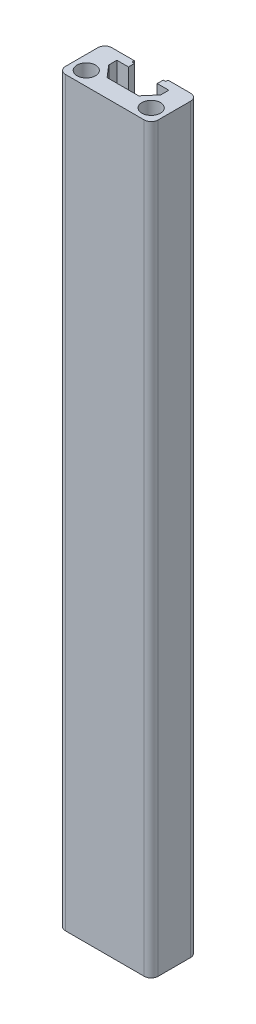
ISO-10303-21;
HEADER;
FILE_DESCRIPTION(('STEP AP214'),'2;1');
FILE_NAME('part.step','',(''),(''),'','','');
FILE_SCHEMA(('AUTOMOTIVE_DESIGN { 1 0 10303 214 1 1 1 1 }'));
ENDSEC;
DATA;
#1=APPLICATION_CONTEXT('core data for automotive mechanical design processes');
#2=APPLICATION_PROTOCOL_DEFINITION('international standard','automotive_design',2000,#1);
#3=PRODUCT_CONTEXT('',#1,'mechanical');
#4=PRODUCT('Part','Part','',(#3));
#5=PRODUCT_RELATED_PRODUCT_CATEGORY('part','',(#4));
#6=PRODUCT_DEFINITION_FORMATION('','',#4);
#7=PRODUCT_DEFINITION_CONTEXT('part definition',#1,'design');
#8=PRODUCT_DEFINITION('design','',#6,#7);
#9=PRODUCT_DEFINITION_SHAPE('','',#8);
#10=(LENGTH_UNIT() NAMED_UNIT(*) SI_UNIT(.MILLI.,.METRE.));
#11=(NAMED_UNIT(*) PLANE_ANGLE_UNIT() SI_UNIT($,.RADIAN.));
#12=(NAMED_UNIT(*) SI_UNIT($,.STERADIAN.) SOLID_ANGLE_UNIT());
#13=UNCERTAINTY_MEASURE_WITH_UNIT(LENGTH_MEASURE(1.E-05),#10,'distance_accuracy_value','');
#14=(GEOMETRIC_REPRESENTATION_CONTEXT(3) GLOBAL_UNCERTAINTY_ASSIGNED_CONTEXT((#13)) GLOBAL_UNIT_ASSIGNED_CONTEXT((#10,
#11,#12)) REPRESENTATION_CONTEXT('',''));
#15=CARTESIAN_POINT('',(0.,0.,0.));
#16=DIRECTION('',(0.,0.,1.));
#17=DIRECTION('',(1.,0.,0.));
#18=AXIS2_PLACEMENT_3D('',#15,#16,#17);
#19=CARTESIAN_POINT('',(0.,160.,0.));
#20=DIRECTION('',(0.,1.,0.));
#21=DIRECTION('',(0.,0.,1.));
#22=AXIS2_PLACEMENT_3D('',#19,#20,#21);
#23=PLANE('',#22);
#24=CARTESIAN_POINT('',(17.,160.,-3.));
#25=DIRECTION('',(0.,1.,0.));
#26=DIRECTION('',(0.,0.,1.));
#27=AXIS2_PLACEMENT_3D('',#24,#25,#26);
#28=CIRCLE('',#27,2.);
#29=CARTESIAN_POINT('',(17.,160.,-0.999999999999997));
#30=VERTEX_POINT('',#29);
#31=EDGE_CURVE('E262',#30,#30,#28,.T.);
#32=ORIENTED_EDGE('',*,*,#31,.F.);
#33=EDGE_LOOP('',(#32));
#34=FACE_BOUND('',#33,.T.);
#35=DIRECTION('',(-1.,0.,0.));
#36=VECTOR('',#35,1.);
#37=CARTESIAN_POINT('',(6.35,160.,-10.));
#38=LINE('',#37,#36);
#39=CARTESIAN_POINT('',(6.35,160.,-10.));
#40=VERTEX_POINT('',#39);
#41=CARTESIAN_POINT('',(1.5,160.,-10.));
#42=VERTEX_POINT('',#41);
#43=EDGE_CURVE('E253',#40,#42,#38,.T.);
#44=ORIENTED_EDGE('',*,*,#43,.T.);
#45=CARTESIAN_POINT('',(1.5,160.,-8.5));
#46=DIRECTION('',(0.,1.,0.));
#47=DIRECTION('',(0.,0.,1.));
#48=AXIS2_PLACEMENT_3D('',#45,#46,#47);
#49=CIRCLE('',#48,1.5);
#50=CARTESIAN_POINT('',(0.,160.,-8.5));
#51=VERTEX_POINT('',#50);
#52=EDGE_CURVE('E393',#42,#51,#49,.T.);
#53=ORIENTED_EDGE('',*,*,#52,.T.);
#54=DIRECTION('',(0.,0.,1.));
#55=VECTOR('',#54,1.);
#56=CARTESIAN_POINT('',(0.,160.,-10.));
#57=LINE('',#56,#55);
#58=CARTESIAN_POINT('',(0.,160.,-1.5));
#59=VERTEX_POINT('',#58);
#60=EDGE_CURVE('E314',#51,#59,#57,.T.);
#61=ORIENTED_EDGE('',*,*,#60,.T.);
#62=CARTESIAN_POINT('',(1.5,160.,-1.5));
#63=DIRECTION('',(0.,1.,0.));
#64=DIRECTION('',(0.,0.,1.));
#65=AXIS2_PLACEMENT_3D('',#62,#63,#64);
#66=CIRCLE('',#65,1.5);
#67=CARTESIAN_POINT('',(1.5,160.,0.));
#68=VERTEX_POINT('',#67);
#69=EDGE_CURVE('E390',#59,#68,#66,.T.);
#70=ORIENTED_EDGE('',*,*,#69,.T.);
#71=DIRECTION('',(1.,0.,0.));
#72=VECTOR('',#71,1.);
#73=CARTESIAN_POINT('',(0.,160.,0.));
#74=LINE('',#73,#72);
#75=CARTESIAN_POINT('',(18.5,160.,0.));
#76=VERTEX_POINT('',#75);
#77=EDGE_CURVE('E522',#68,#76,#74,.T.);
#78=ORIENTED_EDGE('',*,*,#77,.T.);
#79=CARTESIAN_POINT('',(18.5,160.,-1.5));
#80=DIRECTION('',(0.,1.,0.));
#81=DIRECTION('',(0.,0.,1.));
#82=AXIS2_PLACEMENT_3D('',#79,#80,#81);
#83=CIRCLE('',#82,1.5);
#84=CARTESIAN_POINT('',(20.,160.,-1.5));
#85=VERTEX_POINT('',#84);
#86=EDGE_CURVE('E385',#76,#85,#83,.T.);
#87=ORIENTED_EDGE('',*,*,#86,.T.);
#88=DIRECTION('',(0.,0.,-1.));
#89=VECTOR('',#88,1.);
#90=CARTESIAN_POINT('',(20.,160.,0.));
#91=LINE('',#90,#89);
#92=CARTESIAN_POINT('',(20.,160.,-8.5));
#93=VERTEX_POINT('',#92);
#94=EDGE_CURVE('E197',#85,#93,#91,.T.);
#95=ORIENTED_EDGE('',*,*,#94,.T.);
#96=CARTESIAN_POINT('',(18.5,160.,-8.5));
#97=DIRECTION('',(0.,1.,0.));
#98=DIRECTION('',(0.,0.,1.));
#99=AXIS2_PLACEMENT_3D('',#96,#97,#98);
#100=CIRCLE('',#99,1.5);
#101=CARTESIAN_POINT('',(18.5,160.,-10.));
#102=VERTEX_POINT('',#101);
#103=EDGE_CURVE('E55',#93,#102,#100,.T.);
#104=ORIENTED_EDGE('',*,*,#103,.T.);
#105=DIRECTION('',(-1.,0.,0.));
#106=VECTOR('',#105,1.);
#107=CARTESIAN_POINT('',(20.,160.,-10.));
#108=LINE('',#107,#106);
#109=CARTESIAN_POINT('',(13.65,160.,-10.));
#110=VERTEX_POINT('',#109);
#111=EDGE_CURVE('E186',#102,#110,#108,.T.);
#112=ORIENTED_EDGE('',*,*,#111,.T.);
#113=DIRECTION('',(0.,0.,1.));
#114=VECTOR('',#113,1.);
#115=CARTESIAN_POINT('',(13.65,160.,-9.51042760217637));
#116=LINE('',#115,#114);
#117=CARTESIAN_POINT('',(13.65,160.,-9.51042760217637));
#118=VERTEX_POINT('',#117);
#119=EDGE_CURVE('E191',#110,#118,#116,.T.);
#120=ORIENTED_EDGE('',*,*,#119,.T.);
#121=DIRECTION('',(-1.,0.,0.));
#122=VECTOR('',#121,1.);
#123=CARTESIAN_POINT('',(13.1,160.,-9.51042760217637));
#124=LINE('',#123,#122);
#125=CARTESIAN_POINT('',(13.1,160.,-9.51042760217637));
#126=VERTEX_POINT('',#125);
#127=EDGE_CURVE('E214',#118,#126,#124,.T.);
#128=ORIENTED_EDGE('',*,*,#127,.T.);
#129=DIRECTION('',(0.,0.,1.));
#130=VECTOR('',#129,1.);
#131=CARTESIAN_POINT('',(13.1,160.,-8.2));
#132=LINE('',#131,#130);
#133=CARTESIAN_POINT('',(13.1,160.,-8.2));
#134=VERTEX_POINT('',#133);
#135=EDGE_CURVE('E217',#126,#134,#132,.T.);
#136=ORIENTED_EDGE('',*,*,#135,.T.);
#137=DIRECTION('',(1.,0.,0.));
#138=VECTOR('',#137,1.);
#139=CARTESIAN_POINT('',(15.6,160.,-8.2));
#140=LINE('',#139,#138);
#141=CARTESIAN_POINT('',(15.6,160.,-8.2));
#142=VERTEX_POINT('',#141);
#143=EDGE_CURVE('E223',#134,#142,#140,.T.);
#144=ORIENTED_EDGE('',*,*,#143,.T.);
#145=DIRECTION('',(0.,0.,1.));
#146=VECTOR('',#145,1.);
#147=CARTESIAN_POINT('',(15.6,160.,-6.44750713590306));
#148=LINE('',#147,#146);
#149=CARTESIAN_POINT('',(15.6,160.,-6.44750713590306));
#150=VERTEX_POINT('',#149);
#151=EDGE_CURVE('E226',#142,#150,#148,.T.);
#152=ORIENTED_EDGE('',*,*,#151,.T.);
#153=DIRECTION('',(-0.651429062487269,0.,0.758709546893248));
#154=VECTOR('',#153,1.);
#155=CARTESIAN_POINT('',(13.4127068625717,160.,-3.9));
#156=LINE('',#155,#154);
#157=CARTESIAN_POINT('',(13.4127068625717,160.,-3.9));
#158=VERTEX_POINT('',#157);
#159=EDGE_CURVE('E229',#150,#158,#156,.T.);
#160=ORIENTED_EDGE('',*,*,#159,.T.);
#161=DIRECTION('',(-1.,0.,0.));
#162=VECTOR('',#161,1.);
#163=CARTESIAN_POINT('',(6.58729313742833,160.,-3.9));
#164=LINE('',#163,#162);
#165=CARTESIAN_POINT('',(6.58729313742833,160.,-3.9));
#166=VERTEX_POINT('',#165);
#167=EDGE_CURVE('E232',#158,#166,#164,.T.);
#168=ORIENTED_EDGE('',*,*,#167,.T.);
#169=DIRECTION('',(-0.651429062487269,0.,-0.758709546893248));
#170=VECTOR('',#169,1.);
#171=CARTESIAN_POINT('',(4.4,160.,-6.44750713590306));
#172=LINE('',#171,#170);
#173=CARTESIAN_POINT('',(4.4,160.,-6.44750713590306));
#174=VERTEX_POINT('',#173);
#175=EDGE_CURVE('E235',#166,#174,#172,.T.);
#176=ORIENTED_EDGE('',*,*,#175,.T.);
#177=DIRECTION('',(0.,0.,-1.));
#178=VECTOR('',#177,1.);
#179=CARTESIAN_POINT('',(4.4,160.,-8.2));
#180=LINE('',#179,#178);
#181=CARTESIAN_POINT('',(4.4,160.,-8.2));
#182=VERTEX_POINT('',#181);
#183=EDGE_CURVE('E238',#174,#182,#180,.T.);
#184=ORIENTED_EDGE('',*,*,#183,.T.);
#185=DIRECTION('',(1.,0.,0.));
#186=VECTOR('',#185,1.);
#187=CARTESIAN_POINT('',(6.9,160.,-8.2));
#188=LINE('',#187,#186);
#189=CARTESIAN_POINT('',(6.9,160.,-8.2));
#190=VERTEX_POINT('',#189);
#191=EDGE_CURVE('E241',#182,#190,#188,.T.);
#192=ORIENTED_EDGE('',*,*,#191,.T.);
#193=DIRECTION('',(0.,0.,-1.));
#194=VECTOR('',#193,1.);
#195=CARTESIAN_POINT('',(6.9,160.,-9.51042760217637));
#196=LINE('',#195,#194);
#197=CARTESIAN_POINT('',(6.9,160.,-9.51042760217637));
#198=VERTEX_POINT('',#197);
#199=EDGE_CURVE('E244',#190,#198,#196,.T.);
#200=ORIENTED_EDGE('',*,*,#199,.T.);
#201=DIRECTION('',(-1.,0.,0.));
#202=VECTOR('',#201,1.);
#203=CARTESIAN_POINT('',(6.35,160.,-9.51042760217637));
#204=LINE('',#203,#202);
#205=CARTESIAN_POINT('',(6.35,160.,-9.51042760217637));
#206=VERTEX_POINT('',#205);
#207=EDGE_CURVE('E247',#198,#206,#204,.T.);
#208=ORIENTED_EDGE('',*,*,#207,.T.);
#209=DIRECTION('',(0.,0.,-1.));
#210=VECTOR('',#209,1.);
#211=CARTESIAN_POINT('',(6.35,160.,-10.));
#212=LINE('',#211,#210);
#213=EDGE_CURVE('E250',#206,#40,#212,.T.);
#214=ORIENTED_EDGE('',*,*,#213,.T.);
#215=EDGE_LOOP('',(#44,#53,#61,#70,#78,#87,#95,#104,#112,#120,#128,#136,#144,#152,#160,#168,
#176,#184,#192,#200,#208,#214));
#216=FACE_BOUND('',#215,.T.);
#217=CARTESIAN_POINT('',(3.,160.,-3.));
#218=DIRECTION('',(0.,1.,0.));
#219=DIRECTION('',(0.,0.,1.));
#220=AXIS2_PLACEMENT_3D('',#217,#218,#219);
#221=CIRCLE('',#220,2.);
#222=CARTESIAN_POINT('',(3.,160.,-1.));
#223=VERTEX_POINT('',#222);
#224=EDGE_CURVE('E572',#223,#223,#221,.T.);
#225=ORIENTED_EDGE('',*,*,#224,.F.);
#226=EDGE_LOOP('',(#225));
#227=FACE_BOUND('',#226,.T.);
#228=ADVANCED_FACE('F39',(#34,#216,#227),#23,.T.);
#229=CARTESIAN_POINT('',(0.,0.,0.));
#230=DIRECTION('',(0.,1.,0.));
#231=DIRECTION('',(0.,0.,1.));
#232=AXIS2_PLACEMENT_3D('',#229,#230,#231);
#233=PLANE('',#232);
#234=DIRECTION('',(0.,0.,1.));
#235=VECTOR('',#234,1.);
#236=CARTESIAN_POINT('',(0.,0.,-10.));
#237=LINE('',#236,#235);
#238=CARTESIAN_POINT('',(0.,0.,-8.5));
#239=VERTEX_POINT('',#238);
#240=CARTESIAN_POINT('',(0.,0.,-1.5));
#241=VERTEX_POINT('',#240);
#242=EDGE_CURVE('E257',#239,#241,#237,.T.);
#243=ORIENTED_EDGE('',*,*,#242,.F.);
#244=CARTESIAN_POINT('',(1.5,0.,-8.5));
#245=DIRECTION('',(0.,1.,0.));
#246=DIRECTION('',(0.,0.,1.));
#247=AXIS2_PLACEMENT_3D('',#244,#245,#246);
#248=CIRCLE('',#247,1.5);
#249=CARTESIAN_POINT('',(1.5,0.,-10.));
#250=VERTEX_POINT('',#249);
#251=EDGE_CURVE('E379',#239,#250,#248,.F.);
#252=ORIENTED_EDGE('',*,*,#251,.T.);
#253=DIRECTION('',(-1.,0.,0.));
#254=VECTOR('',#253,1.);
#255=CARTESIAN_POINT('',(6.35,0.,-10.));
#256=LINE('',#255,#254);
#257=CARTESIAN_POINT('',(6.35,0.,-10.));
#258=VERTEX_POINT('',#257);
#259=EDGE_CURVE('E310',#258,#250,#256,.T.);
#260=ORIENTED_EDGE('',*,*,#259,.F.);
#261=DIRECTION('',(0.,0.,-1.));
#262=VECTOR('',#261,1.);
#263=CARTESIAN_POINT('',(6.35,0.,-10.));
#264=LINE('',#263,#262);
#265=CARTESIAN_POINT('',(6.35,0.,-9.51042760217637));
#266=VERTEX_POINT('',#265);
#267=EDGE_CURVE('E307',#266,#258,#264,.T.);
#268=ORIENTED_EDGE('',*,*,#267,.F.);
#269=DIRECTION('',(-1.,0.,0.));
#270=VECTOR('',#269,1.);
#271=CARTESIAN_POINT('',(6.35,0.,-9.51042760217637));
#272=LINE('',#271,#270);
#273=CARTESIAN_POINT('',(6.9,0.,-9.51042760217637));
#274=VERTEX_POINT('',#273);
#275=EDGE_CURVE('E304',#274,#266,#272,.T.);
#276=ORIENTED_EDGE('',*,*,#275,.F.);
#277=DIRECTION('',(0.,0.,-1.));
#278=VECTOR('',#277,1.);
#279=CARTESIAN_POINT('',(6.9,0.,-9.51042760217637));
#280=LINE('',#279,#278);
#281=CARTESIAN_POINT('',(6.9,0.,-8.2));
#282=VERTEX_POINT('',#281);
#283=EDGE_CURVE('E301',#282,#274,#280,.T.);
#284=ORIENTED_EDGE('',*,*,#283,.F.);
#285=DIRECTION('',(1.,0.,0.));
#286=VECTOR('',#285,1.);
#287=CARTESIAN_POINT('',(6.9,0.,-8.2));
#288=LINE('',#287,#286);
#289=CARTESIAN_POINT('',(4.4,0.,-8.2));
#290=VERTEX_POINT('',#289);
#291=EDGE_CURVE('E298',#290,#282,#288,.T.);
#292=ORIENTED_EDGE('',*,*,#291,.F.);
#293=DIRECTION('',(0.,0.,-1.));
#294=VECTOR('',#293,1.);
#295=CARTESIAN_POINT('',(4.4,0.,-8.2));
#296=LINE('',#295,#294);
#297=CARTESIAN_POINT('',(4.4,0.,-6.44750713590306));
#298=VERTEX_POINT('',#297);
#299=EDGE_CURVE('E295',#298,#290,#296,.T.);
#300=ORIENTED_EDGE('',*,*,#299,.F.);
#301=DIRECTION('',(-0.651429062487269,0.,-0.758709546893248));
#302=VECTOR('',#301,1.);
#303=CARTESIAN_POINT('',(4.4,0.,-6.44750713590306));
#304=LINE('',#303,#302);
#305=CARTESIAN_POINT('',(6.58729313742833,0.,-3.9));
#306=VERTEX_POINT('',#305);
#307=EDGE_CURVE('E292',#306,#298,#304,.T.);
#308=ORIENTED_EDGE('',*,*,#307,.F.);
#309=DIRECTION('',(-1.,0.,0.));
#310=VECTOR('',#309,1.);
#311=CARTESIAN_POINT('',(6.58729313742833,0.,-3.9));
#312=LINE('',#311,#310);
#313=CARTESIAN_POINT('',(13.4127068625717,0.,-3.9));
#314=VERTEX_POINT('',#313);
#315=EDGE_CURVE('E289',#314,#306,#312,.T.);
#316=ORIENTED_EDGE('',*,*,#315,.F.);
#317=DIRECTION('',(-0.651429062487269,0.,0.758709546893248));
#318=VECTOR('',#317,1.);
#319=CARTESIAN_POINT('',(13.4127068625717,0.,-3.9));
#320=LINE('',#319,#318);
#321=CARTESIAN_POINT('',(15.6,0.,-6.44750713590306));
#322=VERTEX_POINT('',#321);
#323=EDGE_CURVE('E286',#322,#314,#320,.T.);
#324=ORIENTED_EDGE('',*,*,#323,.F.);
#325=DIRECTION('',(0.,0.,1.));
#326=VECTOR('',#325,1.);
#327=CARTESIAN_POINT('',(15.6,0.,-6.44750713590306));
#328=LINE('',#327,#326);
#329=CARTESIAN_POINT('',(15.6,0.,-8.2));
#330=VERTEX_POINT('',#329);
#331=EDGE_CURVE('E283',#330,#322,#328,.T.);
#332=ORIENTED_EDGE('',*,*,#331,.F.);
#333=DIRECTION('',(1.,0.,0.));
#334=VECTOR('',#333,1.);
#335=CARTESIAN_POINT('',(15.6,0.,-8.2));
#336=LINE('',#335,#334);
#337=CARTESIAN_POINT('',(13.1,0.,-8.2));
#338=VERTEX_POINT('',#337);
#339=EDGE_CURVE('E280',#338,#330,#336,.T.);
#340=ORIENTED_EDGE('',*,*,#339,.F.);
#341=DIRECTION('',(0.,0.,1.));
#342=VECTOR('',#341,1.);
#343=CARTESIAN_POINT('',(13.1,0.,-8.2));
#344=LINE('',#343,#342);
#345=CARTESIAN_POINT('',(13.1,0.,-9.51042760217637));
#346=VERTEX_POINT('',#345);
#347=EDGE_CURVE('E277',#346,#338,#344,.T.);
#348=ORIENTED_EDGE('',*,*,#347,.F.);
#349=DIRECTION('',(-1.,0.,0.));
#350=VECTOR('',#349,1.);
#351=CARTESIAN_POINT('',(13.1,0.,-9.51042760217637));
#352=LINE('',#351,#350);
#353=CARTESIAN_POINT('',(13.65,0.,-9.51042760217637));
#354=VERTEX_POINT('',#353);
#355=EDGE_CURVE('E274',#354,#346,#352,.T.);
#356=ORIENTED_EDGE('',*,*,#355,.F.);
#357=DIRECTION('',(0.,0.,1.));
#358=VECTOR('',#357,1.);
#359=CARTESIAN_POINT('',(13.65,0.,-9.51042760217637));
#360=LINE('',#359,#358);
#361=CARTESIAN_POINT('',(13.65,0.,-10.));
#362=VERTEX_POINT('',#361);
#363=EDGE_CURVE('E271',#362,#354,#360,.T.);
#364=ORIENTED_EDGE('',*,*,#363,.F.);
#365=DIRECTION('',(-1.,0.,0.));
#366=VECTOR('',#365,1.);
#367=CARTESIAN_POINT('',(20.,0.,-10.));
#368=LINE('',#367,#366);
#369=CARTESIAN_POINT('',(18.5,0.,-10.));
#370=VERTEX_POINT('',#369);
#371=EDGE_CURVE('E203',#370,#362,#368,.T.);
#372=ORIENTED_EDGE('',*,*,#371,.F.);
#373=CARTESIAN_POINT('',(18.5,0.,-8.5));
#374=DIRECTION('',(0.,1.,0.));
#375=DIRECTION('',(0.,0.,1.));
#376=AXIS2_PLACEMENT_3D('',#373,#374,#375);
#377=CIRCLE('',#376,1.5);
#378=CARTESIAN_POINT('',(20.,0.,-8.5));
#379=VERTEX_POINT('',#378);
#380=EDGE_CURVE('E373',#370,#379,#377,.F.);
#381=ORIENTED_EDGE('',*,*,#380,.T.);
#382=DIRECTION('',(0.,0.,-1.));
#383=VECTOR('',#382,1.);
#384=CARTESIAN_POINT('',(20.,0.,0.));
#385=LINE('',#384,#383);
#386=CARTESIAN_POINT('',(20.,0.,-1.5));
#387=VERTEX_POINT('',#386);
#388=EDGE_CURVE('E266',#387,#379,#385,.T.);
#389=ORIENTED_EDGE('',*,*,#388,.F.);
#390=CARTESIAN_POINT('',(18.5,0.,-1.5));
#391=DIRECTION('',(0.,1.,0.));
#392=DIRECTION('',(0.,0.,1.));
#393=AXIS2_PLACEMENT_3D('',#390,#391,#392);
#394=CIRCLE('',#393,1.5);
#395=CARTESIAN_POINT('',(18.5,0.,0.));
#396=VERTEX_POINT('',#395);
#397=EDGE_CURVE('E370',#387,#396,#394,.F.);
#398=ORIENTED_EDGE('',*,*,#397,.T.);
#399=DIRECTION('',(1.,0.,0.));
#400=VECTOR('',#399,1.);
#401=CARTESIAN_POINT('',(0.,0.,0.));
#402=LINE('',#401,#400);
#403=CARTESIAN_POINT('',(1.5,0.,0.));
#404=VERTEX_POINT('',#403);
#405=EDGE_CURVE('E261',#404,#396,#402,.T.);
#406=ORIENTED_EDGE('',*,*,#405,.F.);
#407=CARTESIAN_POINT('',(1.5,0.,-1.5));
#408=DIRECTION('',(0.,1.,0.));
#409=DIRECTION('',(0.,0.,1.));
#410=AXIS2_PLACEMENT_3D('',#407,#408,#409);
#411=CIRCLE('',#410,1.5);
#412=EDGE_CURVE('E376',#404,#241,#411,.F.);
#413=ORIENTED_EDGE('',*,*,#412,.T.);
#414=EDGE_LOOP('',(#243,#252,#260,#268,#276,#284,#292,#300,#308,#316,#324,#332,#340,#348,#356,
#364,#372,#381,#389,#398,#406,#413));
#415=FACE_BOUND('',#414,.T.);
#416=CARTESIAN_POINT('',(17.,0.,-3.));
#417=DIRECTION('',(0.,1.,0.));
#418=DIRECTION('',(0.,0.,1.));
#419=AXIS2_PLACEMENT_3D('',#416,#417,#418);
#420=CIRCLE('',#419,2.);
#421=CARTESIAN_POINT('',(17.,0.,-0.999999999999997));
#422=VERTEX_POINT('',#421);
#423=EDGE_CURVE('E528',#422,#422,#420,.T.);
#424=ORIENTED_EDGE('',*,*,#423,.T.);
#425=EDGE_LOOP('',(#424));
#426=FACE_BOUND('',#425,.T.);
#427=CARTESIAN_POINT('',(3.,0.,-3.));
#428=DIRECTION('',(0.,1.,0.));
#429=DIRECTION('',(0.,0.,1.));
#430=AXIS2_PLACEMENT_3D('',#427,#428,#429);
#431=CIRCLE('',#430,2.);
#432=CARTESIAN_POINT('',(3.,0.,-1.));
#433=VERTEX_POINT('',#432);
#434=EDGE_CURVE('E576',#433,#433,#431,.T.);
#435=ORIENTED_EDGE('',*,*,#434,.T.);
#436=EDGE_LOOP('',(#435));
#437=FACE_BOUND('',#436,.T.);
#438=ADVANCED_FACE('F414',(#415,#426,#437),#233,.F.);
#439=CARTESIAN_POINT('',(0.,160.,-10.));
#440=DIRECTION('',(1.,0.,0.));
#441=DIRECTION('',(0.,0.,-1.));
#442=AXIS2_PLACEMENT_3D('',#439,#440,#441);
#443=PLANE('',#442);
#444=ORIENTED_EDGE('',*,*,#60,.F.);
#445=DIRECTION('',(0.,-1.,0.));
#446=VECTOR('',#445,1.);
#447=CARTESIAN_POINT('',(0.,160.,-8.5));
#448=LINE('',#447,#446);
#449=EDGE_CURVE('E366',#51,#239,#448,.T.);
#450=ORIENTED_EDGE('',*,*,#449,.T.);
#451=ORIENTED_EDGE('',*,*,#242,.T.);
#452=DIRECTION('',(0.,-1.,0.));
#453=VECTOR('',#452,1.);
#454=CARTESIAN_POINT('',(0.,160.,-1.5));
#455=LINE('',#454,#453);
#456=EDGE_CURVE('E207',#241,#59,#455,.F.);
#457=ORIENTED_EDGE('',*,*,#456,.T.);
#458=EDGE_LOOP('',(#444,#450,#451,#457));
#459=FACE_BOUND('',#458,.T.);
#460=ADVANCED_FACE('F434',(#459),#443,.F.);
#461=CARTESIAN_POINT('',(0.,160.,0.));
#462=DIRECTION('',(0.,0.,-1.));
#463=DIRECTION('',(-1.,0.,0.));
#464=AXIS2_PLACEMENT_3D('',#461,#462,#463);
#465=PLANE('',#464);
#466=ORIENTED_EDGE('',*,*,#77,.F.);
#467=DIRECTION('',(0.,-1.,0.));
#468=VECTOR('',#467,1.);
#469=CARTESIAN_POINT('',(1.5,160.,0.));
#470=LINE('',#469,#468);
#471=EDGE_CURVE('E399',#68,#404,#470,.T.);
#472=ORIENTED_EDGE('',*,*,#471,.T.);
#473=ORIENTED_EDGE('',*,*,#405,.T.);
#474=DIRECTION('',(0.,-1.,0.));
#475=VECTOR('',#474,1.);
#476=CARTESIAN_POINT('',(18.5,160.,0.));
#477=LINE('',#476,#475);
#478=EDGE_CURVE('E396',#396,#76,#477,.F.);
#479=ORIENTED_EDGE('',*,*,#478,.T.);
#480=EDGE_LOOP('',(#466,#472,#473,#479));
#481=FACE_BOUND('',#480,.T.);
#482=ADVANCED_FACE('F499',(#481),#465,.F.);
#483=CARTESIAN_POINT('',(20.,160.,0.));
#484=DIRECTION('',(-1.,0.,0.));
#485=DIRECTION('',(0.,0.,1.));
#486=AXIS2_PLACEMENT_3D('',#483,#484,#485);
#487=PLANE('',#486);
#488=ORIENTED_EDGE('',*,*,#388,.T.);
#489=DIRECTION('',(0.,-1.,0.));
#490=VECTOR('',#489,1.);
#491=CARTESIAN_POINT('',(20.,160.,-8.5));
#492=LINE('',#491,#490);
#493=EDGE_CURVE('E11',#379,#93,#492,.F.);
#494=ORIENTED_EDGE('',*,*,#493,.T.);
#495=ORIENTED_EDGE('',*,*,#94,.F.);
#496=DIRECTION('',(0.,-1.,0.));
#497=VECTOR('',#496,1.);
#498=CARTESIAN_POINT('',(20.,160.,-1.5));
#499=LINE('',#498,#497);
#500=EDGE_CURVE('E48',#85,#387,#499,.T.);
#501=ORIENTED_EDGE('',*,*,#500,.T.);
#502=EDGE_LOOP('',(#488,#494,#495,#501));
#503=FACE_BOUND('',#502,.T.);
#504=ADVANCED_FACE('F409',(#503),#487,.F.);
#505=CARTESIAN_POINT('',(20.,160.,-10.));
#506=DIRECTION('',(0.,0.,1.));
#507=DIRECTION('',(1.,0.,0.));
#508=AXIS2_PLACEMENT_3D('',#505,#506,#507);
#509=PLANE('',#508);
#510=ORIENTED_EDGE('',*,*,#111,.F.);
#511=DIRECTION('',(0.,-1.,0.));
#512=VECTOR('',#511,1.);
#513=CARTESIAN_POINT('',(18.5,160.,-10.));
#514=LINE('',#513,#512);
#515=EDGE_CURVE('E403',#102,#370,#514,.T.);
#516=ORIENTED_EDGE('',*,*,#515,.T.);
#517=ORIENTED_EDGE('',*,*,#371,.T.);
#518=DIRECTION('',(0.,-1.,0.));
#519=VECTOR('',#518,1.);
#520=CARTESIAN_POINT('',(13.65,160.,-10.));
#521=LINE('',#520,#519);
#522=EDGE_CURVE('E200',#110,#362,#521,.T.);
#523=ORIENTED_EDGE('',*,*,#522,.F.);
#524=EDGE_LOOP('',(#510,#516,#517,#523));
#525=FACE_BOUND('',#524,.T.);
#526=ADVANCED_FACE('F201',(#525),#509,.F.);
#527=CARTESIAN_POINT('',(13.65,160.,-9.51042760217637));
#528=DIRECTION('',(1.,0.,0.));
#529=DIRECTION('',(0.,0.,-1.));
#530=AXIS2_PLACEMENT_3D('',#527,#528,#529);
#531=PLANE('',#530);
#532=ORIENTED_EDGE('',*,*,#363,.T.);
#533=DIRECTION('',(0.,-1.,0.));
#534=VECTOR('',#533,1.);
#535=CARTESIAN_POINT('',(13.65,160.,-9.51042760217637));
#536=LINE('',#535,#534);
#537=EDGE_CURVE('E208',#118,#354,#536,.T.);
#538=ORIENTED_EDGE('',*,*,#537,.F.);
#539=ORIENTED_EDGE('',*,*,#119,.F.);
#540=ORIENTED_EDGE('',*,*,#522,.T.);
#541=EDGE_LOOP('',(#532,#538,#539,#540));
#542=FACE_BOUND('',#541,.T.);
#543=ADVANCED_FACE('F210',(#542),#531,.F.);
#544=CARTESIAN_POINT('',(13.1,160.,-9.51042760217637));
#545=DIRECTION('',(0.,0.,1.));
#546=DIRECTION('',(1.,0.,0.));
#547=AXIS2_PLACEMENT_3D('',#544,#545,#546);
#548=PLANE('',#547);
#549=ORIENTED_EDGE('',*,*,#355,.T.);
#550=DIRECTION('',(0.,-1.,0.));
#551=VECTOR('',#550,1.);
#552=CARTESIAN_POINT('',(13.1,160.,-9.51042760217637));
#553=LINE('',#552,#551);
#554=EDGE_CURVE('E358',#126,#346,#553,.T.);
#555=ORIENTED_EDGE('',*,*,#554,.F.);
#556=ORIENTED_EDGE('',*,*,#127,.F.);
#557=ORIENTED_EDGE('',*,*,#537,.T.);
#558=EDGE_LOOP('',(#549,#555,#556,#557));
#559=FACE_BOUND('',#558,.T.);
#560=ADVANCED_FACE('F488',(#559),#548,.F.);
#561=CARTESIAN_POINT('',(13.1,160.,-8.2));
#562=DIRECTION('',(1.,0.,0.));
#563=DIRECTION('',(0.,0.,-1.));
#564=AXIS2_PLACEMENT_3D('',#561,#562,#563);
#565=PLANE('',#564);
#566=ORIENTED_EDGE('',*,*,#347,.T.);
#567=DIRECTION('',(0.,-1.,0.));
#568=VECTOR('',#567,1.);
#569=CARTESIAN_POINT('',(13.1,160.,-8.2));
#570=LINE('',#569,#568);
#571=EDGE_CURVE('E354',#134,#338,#570,.T.);
#572=ORIENTED_EDGE('',*,*,#571,.F.);
#573=ORIENTED_EDGE('',*,*,#135,.F.);
#574=ORIENTED_EDGE('',*,*,#554,.T.);
#575=EDGE_LOOP('',(#566,#572,#573,#574));
#576=FACE_BOUND('',#575,.T.);
#577=ADVANCED_FACE('F484',(#576),#565,.F.);
#578=CARTESIAN_POINT('',(15.6,160.,-8.2));
#579=DIRECTION('',(0.,0.,-1.));
#580=DIRECTION('',(-1.,0.,0.));
#581=AXIS2_PLACEMENT_3D('',#578,#579,#580);
#582=PLANE('',#581);
#583=ORIENTED_EDGE('',*,*,#339,.T.);
#584=DIRECTION('',(0.,-1.,0.));
#585=VECTOR('',#584,1.);
#586=CARTESIAN_POINT('',(15.6,160.,-8.2));
#587=LINE('',#586,#585);
#588=EDGE_CURVE('E350',#142,#330,#587,.T.);
#589=ORIENTED_EDGE('',*,*,#588,.F.);
#590=ORIENTED_EDGE('',*,*,#143,.F.);
#591=ORIENTED_EDGE('',*,*,#571,.T.);
#592=EDGE_LOOP('',(#583,#589,#590,#591));
#593=FACE_BOUND('',#592,.T.);
#594=ADVANCED_FACE('F480',(#593),#582,.F.);
#595=CARTESIAN_POINT('',(15.6,160.,-6.44750713590306));
#596=DIRECTION('',(1.,0.,0.));
#597=DIRECTION('',(0.,0.,-1.));
#598=AXIS2_PLACEMENT_3D('',#595,#596,#597);
#599=PLANE('',#598);
#600=ORIENTED_EDGE('',*,*,#331,.T.);
#601=DIRECTION('',(0.,-1.,0.));
#602=VECTOR('',#601,1.);
#603=CARTESIAN_POINT('',(15.6,160.,-6.44750713590306));
#604=LINE('',#603,#602);
#605=EDGE_CURVE('E346',#150,#322,#604,.T.);
#606=ORIENTED_EDGE('',*,*,#605,.F.);
#607=ORIENTED_EDGE('',*,*,#151,.F.);
#608=ORIENTED_EDGE('',*,*,#588,.T.);
#609=EDGE_LOOP('',(#600,#606,#607,#608));
#610=FACE_BOUND('',#609,.T.);
#611=ADVANCED_FACE('F476',(#610),#599,.F.);
#612=CARTESIAN_POINT('',(13.4127068625717,160.,-3.9));
#613=DIRECTION('',(0.758709546893248,0.,0.651429062487269));
#614=DIRECTION('',(0.651429062487269,0.,-0.758709546893248));
#615=AXIS2_PLACEMENT_3D('',#612,#613,#614);
#616=PLANE('',#615);
#617=ORIENTED_EDGE('',*,*,#323,.T.);
#618=DIRECTION('',(0.,-1.,0.));
#619=VECTOR('',#618,1.);
#620=CARTESIAN_POINT('',(13.4127068625717,160.,-3.9));
#621=LINE('',#620,#619);
#622=EDGE_CURVE('E342',#158,#314,#621,.T.);
#623=ORIENTED_EDGE('',*,*,#622,.F.);
#624=ORIENTED_EDGE('',*,*,#159,.F.);
#625=ORIENTED_EDGE('',*,*,#605,.T.);
#626=EDGE_LOOP('',(#617,#623,#624,#625));
#627=FACE_BOUND('',#626,.T.);
#628=ADVANCED_FACE('F472',(#627),#616,.F.);
#629=CARTESIAN_POINT('',(6.58729313742833,160.,-3.9));
#630=DIRECTION('',(0.,0.,1.));
#631=DIRECTION('',(1.,0.,0.));
#632=AXIS2_PLACEMENT_3D('',#629,#630,#631);
#633=PLANE('',#632);
#634=ORIENTED_EDGE('',*,*,#315,.T.);
#635=DIRECTION('',(0.,-1.,0.));
#636=VECTOR('',#635,1.);
#637=CARTESIAN_POINT('',(6.58729313742833,160.,-3.9));
#638=LINE('',#637,#636);
#639=EDGE_CURVE('E338',#166,#306,#638,.T.);
#640=ORIENTED_EDGE('',*,*,#639,.F.);
#641=ORIENTED_EDGE('',*,*,#167,.F.);
#642=ORIENTED_EDGE('',*,*,#622,.T.);
#643=EDGE_LOOP('',(#634,#640,#641,#642));
#644=FACE_BOUND('',#643,.T.);
#645=ADVANCED_FACE('F468',(#644),#633,.F.);
#646=CARTESIAN_POINT('',(4.4,160.,-6.44750713590306));
#647=DIRECTION('',(-0.758709546893248,0.,0.651429062487269));
#648=DIRECTION('',(0.651429062487269,0.,0.758709546893248));
#649=AXIS2_PLACEMENT_3D('',#646,#647,#648);
#650=PLANE('',#649);
#651=ORIENTED_EDGE('',*,*,#307,.T.);
#652=DIRECTION('',(0.,-1.,0.));
#653=VECTOR('',#652,1.);
#654=CARTESIAN_POINT('',(4.4,160.,-6.44750713590306));
#655=LINE('',#654,#653);
#656=EDGE_CURVE('E334',#174,#298,#655,.T.);
#657=ORIENTED_EDGE('',*,*,#656,.F.);
#658=ORIENTED_EDGE('',*,*,#175,.F.);
#659=ORIENTED_EDGE('',*,*,#639,.T.);
#660=EDGE_LOOP('',(#651,#657,#658,#659));
#661=FACE_BOUND('',#660,.T.);
#662=ADVANCED_FACE('F464',(#661),#650,.F.);
#663=CARTESIAN_POINT('',(4.4,160.,-8.2));
#664=DIRECTION('',(-1.,0.,0.));
#665=DIRECTION('',(0.,0.,1.));
#666=AXIS2_PLACEMENT_3D('',#663,#664,#665);
#667=PLANE('',#666);
#668=ORIENTED_EDGE('',*,*,#299,.T.);
#669=DIRECTION('',(0.,-1.,0.));
#670=VECTOR('',#669,1.);
#671=CARTESIAN_POINT('',(4.4,160.,-8.2));
#672=LINE('',#671,#670);
#673=EDGE_CURVE('E330',#182,#290,#672,.T.);
#674=ORIENTED_EDGE('',*,*,#673,.F.);
#675=ORIENTED_EDGE('',*,*,#183,.F.);
#676=ORIENTED_EDGE('',*,*,#656,.T.);
#677=EDGE_LOOP('',(#668,#674,#675,#676));
#678=FACE_BOUND('',#677,.T.);
#679=ADVANCED_FACE('F460',(#678),#667,.F.);
#680=CARTESIAN_POINT('',(6.9,160.,-8.2));
#681=DIRECTION('',(0.,0.,-1.));
#682=DIRECTION('',(-1.,0.,0.));
#683=AXIS2_PLACEMENT_3D('',#680,#681,#682);
#684=PLANE('',#683);
#685=ORIENTED_EDGE('',*,*,#291,.T.);
#686=DIRECTION('',(0.,-1.,0.));
#687=VECTOR('',#686,1.);
#688=CARTESIAN_POINT('',(6.9,160.,-8.2));
#689=LINE('',#688,#687);
#690=EDGE_CURVE('E326',#190,#282,#689,.T.);
#691=ORIENTED_EDGE('',*,*,#690,.F.);
#692=ORIENTED_EDGE('',*,*,#191,.F.);
#693=ORIENTED_EDGE('',*,*,#673,.T.);
#694=EDGE_LOOP('',(#685,#691,#692,#693));
#695=FACE_BOUND('',#694,.T.);
#696=ADVANCED_FACE('F456',(#695),#684,.F.);
#697=CARTESIAN_POINT('',(6.9,160.,-9.51042760217637));
#698=DIRECTION('',(-1.,0.,0.));
#699=DIRECTION('',(0.,0.,1.));
#700=AXIS2_PLACEMENT_3D('',#697,#698,#699);
#701=PLANE('',#700);
#702=ORIENTED_EDGE('',*,*,#283,.T.);
#703=DIRECTION('',(0.,-1.,0.));
#704=VECTOR('',#703,1.);
#705=CARTESIAN_POINT('',(6.9,160.,-9.51042760217637));
#706=LINE('',#705,#704);
#707=EDGE_CURVE('E322',#198,#274,#706,.T.);
#708=ORIENTED_EDGE('',*,*,#707,.F.);
#709=ORIENTED_EDGE('',*,*,#199,.F.);
#710=ORIENTED_EDGE('',*,*,#690,.T.);
#711=EDGE_LOOP('',(#702,#708,#709,#710));
#712=FACE_BOUND('',#711,.T.);
#713=ADVANCED_FACE('F452',(#712),#701,.F.);
#714=CARTESIAN_POINT('',(6.35,160.,-9.51042760217637));
#715=DIRECTION('',(0.,0.,1.));
#716=DIRECTION('',(1.,0.,0.));
#717=AXIS2_PLACEMENT_3D('',#714,#715,#716);
#718=PLANE('',#717);
#719=ORIENTED_EDGE('',*,*,#275,.T.);
#720=DIRECTION('',(0.,-1.,0.));
#721=VECTOR('',#720,1.);
#722=CARTESIAN_POINT('',(6.35,160.,-9.51042760217637));
#723=LINE('',#722,#721);
#724=EDGE_CURVE('E318',#206,#266,#723,.T.);
#725=ORIENTED_EDGE('',*,*,#724,.F.);
#726=ORIENTED_EDGE('',*,*,#207,.F.);
#727=ORIENTED_EDGE('',*,*,#707,.T.);
#728=EDGE_LOOP('',(#719,#725,#726,#727));
#729=FACE_BOUND('',#728,.T.);
#730=ADVANCED_FACE('F448',(#729),#718,.F.);
#731=CARTESIAN_POINT('',(6.35,160.,-10.));
#732=DIRECTION('',(-1.,0.,0.));
#733=DIRECTION('',(0.,0.,1.));
#734=AXIS2_PLACEMENT_3D('',#731,#732,#733);
#735=PLANE('',#734);
#736=ORIENTED_EDGE('',*,*,#267,.T.);
#737=DIRECTION('',(0.,-1.,0.));
#738=VECTOR('',#737,1.);
#739=CARTESIAN_POINT('',(6.35,160.,-10.));
#740=LINE('',#739,#738);
#741=EDGE_CURVE('E256',#40,#258,#740,.T.);
#742=ORIENTED_EDGE('',*,*,#741,.F.);
#743=ORIENTED_EDGE('',*,*,#213,.F.);
#744=ORIENTED_EDGE('',*,*,#724,.T.);
#745=EDGE_LOOP('',(#736,#742,#743,#744));
#746=FACE_BOUND('',#745,.T.);
#747=ADVANCED_FACE('F444',(#746),#735,.F.);
#748=CARTESIAN_POINT('',(6.35,160.,-10.));
#749=DIRECTION('',(0.,0.,1.));
#750=DIRECTION('',(1.,0.,0.));
#751=AXIS2_PLACEMENT_3D('',#748,#749,#750);
#752=PLANE('',#751);
#753=ORIENTED_EDGE('',*,*,#259,.T.);
#754=DIRECTION('',(0.,-1.,0.));
#755=VECTOR('',#754,1.);
#756=CARTESIAN_POINT('',(1.5,160.,-10.));
#757=LINE('',#756,#755);
#758=EDGE_CURVE('E382',#250,#42,#757,.F.);
#759=ORIENTED_EDGE('',*,*,#758,.T.);
#760=ORIENTED_EDGE('',*,*,#43,.F.);
#761=ORIENTED_EDGE('',*,*,#741,.T.);
#762=EDGE_LOOP('',(#753,#759,#760,#761));
#763=FACE_BOUND('',#762,.T.);
#764=ADVANCED_FACE('F441',(#763),#752,.F.);
#765=CARTESIAN_POINT('',(17.,160.,-3.));
#766=DIRECTION('',(0.,-1.,0.));
#767=DIRECTION('',(0.,0.,-1.));
#768=AXIS2_PLACEMENT_3D('',#765,#766,#767);
#769=CYLINDRICAL_SURFACE('',#768,2.);
#770=ORIENTED_EDGE('',*,*,#31,.T.);
#771=EDGE_LOOP('',(#770));
#772=FACE_BOUND('',#771,.T.);
#773=ORIENTED_EDGE('',*,*,#423,.F.);
#774=EDGE_LOOP('',(#773));
#775=FACE_BOUND('',#774,.T.);
#776=ADVANCED_FACE('F438',(#772,#775),#769,.F.);
#777=CARTESIAN_POINT('',(3.,160.,-3.));
#778=DIRECTION('',(0.,-1.,0.));
#779=DIRECTION('',(0.,0.,-1.));
#780=AXIS2_PLACEMENT_3D('',#777,#778,#779);
#781=CYLINDRICAL_SURFACE('',#780,2.);
#782=ORIENTED_EDGE('',*,*,#224,.T.);
#783=EDGE_LOOP('',(#782));
#784=FACE_BOUND('',#783,.T.);
#785=ORIENTED_EDGE('',*,*,#434,.F.);
#786=EDGE_LOOP('',(#785));
#787=FACE_BOUND('',#786,.T.);
#788=ADVANCED_FACE('F507',(#784,#787),#781,.F.);
#789=CARTESIAN_POINT('',(1.5,160.,-8.5));
#790=DIRECTION('',(0.,-1.,0.));
#791=DIRECTION('',(0.,0.,-1.));
#792=AXIS2_PLACEMENT_3D('',#789,#790,#791);
#793=CYLINDRICAL_SURFACE('',#792,1.5);
#794=ORIENTED_EDGE('',*,*,#52,.F.);
#795=ORIENTED_EDGE('',*,*,#758,.F.);
#796=ORIENTED_EDGE('',*,*,#251,.F.);
#797=ORIENTED_EDGE('',*,*,#449,.F.);
#798=EDGE_LOOP('',(#794,#795,#796,#797));
#799=FACE_BOUND('',#798,.T.);
#800=ADVANCED_FACE('F425',(#799),#793,.T.);
#801=CARTESIAN_POINT('',(1.5,160.,-1.5));
#802=DIRECTION('',(0.,-1.,0.));
#803=DIRECTION('',(0.,0.,-1.));
#804=AXIS2_PLACEMENT_3D('',#801,#802,#803);
#805=CYLINDRICAL_SURFACE('',#804,1.5);
#806=ORIENTED_EDGE('',*,*,#69,.F.);
#807=ORIENTED_EDGE('',*,*,#456,.F.);
#808=ORIENTED_EDGE('',*,*,#412,.F.);
#809=ORIENTED_EDGE('',*,*,#471,.F.);
#810=EDGE_LOOP('',(#806,#807,#808,#809));
#811=FACE_BOUND('',#810,.T.);
#812=ADVANCED_FACE('F420',(#811),#805,.T.);
#813=CARTESIAN_POINT('',(18.5,160.,-8.5));
#814=DIRECTION('',(0.,-1.,0.));
#815=DIRECTION('',(0.,0.,-1.));
#816=AXIS2_PLACEMENT_3D('',#813,#814,#815);
#817=CYLINDRICAL_SURFACE('',#816,1.5);
#818=ORIENTED_EDGE('',*,*,#103,.F.);
#819=ORIENTED_EDGE('',*,*,#493,.F.);
#820=ORIENTED_EDGE('',*,*,#380,.F.);
#821=ORIENTED_EDGE('',*,*,#515,.F.);
#822=EDGE_LOOP('',(#818,#819,#820,#821));
#823=FACE_BOUND('',#822,.T.);
#824=ADVANCED_FACE('F418',(#823),#817,.T.);
#825=CARTESIAN_POINT('',(18.5,160.,-1.5));
#826=DIRECTION('',(0.,-1.,0.));
#827=DIRECTION('',(0.,0.,-1.));
#828=AXIS2_PLACEMENT_3D('',#825,#826,#827);
#829=CYLINDRICAL_SURFACE('',#828,1.5);
#830=ORIENTED_EDGE('',*,*,#86,.F.);
#831=ORIENTED_EDGE('',*,*,#478,.F.);
#832=ORIENTED_EDGE('',*,*,#397,.F.);
#833=ORIENTED_EDGE('',*,*,#500,.F.);
#834=EDGE_LOOP('',(#830,#831,#832,#833));
#835=FACE_BOUND('',#834,.T.);
#836=ADVANCED_FACE('F41',(#835),#829,.T.);
#837=CLOSED_SHELL('',(#228,#438,#460,#482,#504,#526,#543,#560,#577,#594,#611,#628,#645,#662,
#679,#696,#713,#730,#747,#764,#776,#788,#800,#812,#824,#836));
#838=MANIFOLD_SOLID_BREP('B2',#837);
#839=ADVANCED_BREP_SHAPE_REPRESENTATION('',(#18,#838),#14);
#840=SHAPE_DEFINITION_REPRESENTATION(#9,#839);
ENDSEC;
END-ISO-10303-21;
